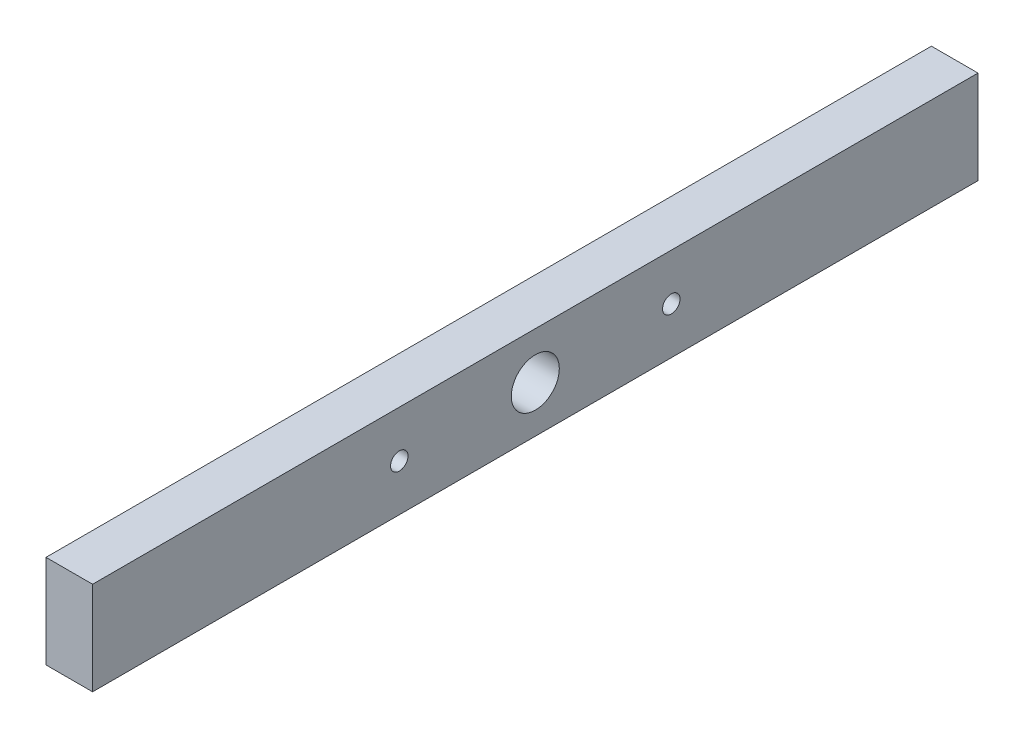
ISO-10303-21;
HEADER;
FILE_DESCRIPTION(('STEP AP214'),'2;1');
FILE_NAME('part.step','',(''),(''),'','','');
FILE_SCHEMA(('AUTOMOTIVE_DESIGN { 1 0 10303 214 1 1 1 1 }'));
ENDSEC;
DATA;
#1=APPLICATION_CONTEXT('core data for automotive mechanical design processes');
#2=APPLICATION_PROTOCOL_DEFINITION('international standard','automotive_design',2000,#1);
#3=PRODUCT_CONTEXT('',#1,'mechanical');
#4=PRODUCT('Part','Part','',(#3));
#5=PRODUCT_RELATED_PRODUCT_CATEGORY('part','',(#4));
#6=PRODUCT_DEFINITION_FORMATION('','',#4);
#7=PRODUCT_DEFINITION_CONTEXT('part definition',#1,'design');
#8=PRODUCT_DEFINITION('design','',#6,#7);
#9=PRODUCT_DEFINITION_SHAPE('','',#8);
#10=(LENGTH_UNIT() NAMED_UNIT(*) SI_UNIT(.MILLI.,.METRE.));
#11=(NAMED_UNIT(*) PLANE_ANGLE_UNIT() SI_UNIT($,.RADIAN.));
#12=(NAMED_UNIT(*) SI_UNIT($,.STERADIAN.) SOLID_ANGLE_UNIT());
#13=UNCERTAINTY_MEASURE_WITH_UNIT(LENGTH_MEASURE(1.E-05),#10,'distance_accuracy_value','');
#14=(GEOMETRIC_REPRESENTATION_CONTEXT(3) GLOBAL_UNCERTAINTY_ASSIGNED_CONTEXT((#13)) GLOBAL_UNIT_ASSIGNED_CONTEXT((#10,
#11,#12)) REPRESENTATION_CONTEXT('',''));
#15=CARTESIAN_POINT('',(0.,0.,0.));
#16=DIRECTION('',(0.,0.,1.));
#17=DIRECTION('',(1.,0.,0.));
#18=AXIS2_PLACEMENT_3D('',#15,#16,#17);
#19=CARTESIAN_POINT('',(20.,0.,0.));
#20=DIRECTION('',(0.,1.,0.));
#21=DIRECTION('',(0.,0.,1.));
#22=AXIS2_PLACEMENT_3D('',#19,#20,#21);
#23=PLANE('',#22);
#24=DIRECTION('',(0.,0.,-1.));
#25=VECTOR('',#24,1.);
#26=CARTESIAN_POINT('',(0.,0.,0.));
#27=LINE('',#26,#25);
#28=CARTESIAN_POINT('',(0.,0.,0.));
#29=VERTEX_POINT('',#28);
#30=CARTESIAN_POINT('',(0.,0.,-380.));
#31=VERTEX_POINT('',#30);
#32=EDGE_CURVE('E126',#29,#31,#27,.T.);
#33=ORIENTED_EDGE('',*,*,#32,.T.);
#34=DIRECTION('',(-1.,0.,0.));
#35=VECTOR('',#34,1.);
#36=CARTESIAN_POINT('',(20.,0.,-380.));
#37=LINE('',#36,#35);
#38=CARTESIAN_POINT('',(20.,0.,-380.));
#39=VERTEX_POINT('',#38);
#40=EDGE_CURVE('E11',#39,#31,#37,.T.);
#41=ORIENTED_EDGE('',*,*,#40,.F.);
#42=DIRECTION('',(0.,0.,-1.));
#43=VECTOR('',#42,1.);
#44=CARTESIAN_POINT('',(20.,0.,0.));
#45=LINE('',#44,#43);
#46=CARTESIAN_POINT('',(20.,0.,0.));
#47=VERTEX_POINT('',#46);
#48=EDGE_CURVE('E96',#47,#39,#45,.T.);
#49=ORIENTED_EDGE('',*,*,#48,.F.);
#50=DIRECTION('',(-1.,0.,0.));
#51=VECTOR('',#50,1.);
#52=CARTESIAN_POINT('',(20.,0.,0.));
#53=LINE('',#52,#51);
#54=EDGE_CURVE('E63',#47,#29,#53,.T.);
#55=ORIENTED_EDGE('',*,*,#54,.T.);
#56=EDGE_LOOP('',(#33,#41,#49,#55));
#57=FACE_BOUND('',#56,.T.);
#58=ADVANCED_FACE('F45',(#57),#23,.F.);
#59=CARTESIAN_POINT('',(20.,0.,-380.));
#60=DIRECTION('',(0.,0.,1.));
#61=DIRECTION('',(1.,0.,0.));
#62=AXIS2_PLACEMENT_3D('',#59,#60,#61);
#63=PLANE('',#62);
#64=DIRECTION('',(0.,1.,0.));
#65=VECTOR('',#64,1.);
#66=CARTESIAN_POINT('',(0.,0.,-380.));
#67=LINE('',#66,#65);
#68=CARTESIAN_POINT('',(0.,40.,-380.));
#69=VERTEX_POINT('',#68);
#70=EDGE_CURVE('E102',#31,#69,#67,.T.);
#71=ORIENTED_EDGE('',*,*,#70,.T.);
#72=DIRECTION('',(-1.,0.,0.));
#73=VECTOR('',#72,1.);
#74=CARTESIAN_POINT('',(20.,40.,-380.));
#75=LINE('',#74,#73);
#76=CARTESIAN_POINT('',(20.,40.,-380.));
#77=VERTEX_POINT('',#76);
#78=EDGE_CURVE('E55',#77,#69,#75,.T.);
#79=ORIENTED_EDGE('',*,*,#78,.F.);
#80=DIRECTION('',(0.,1.,0.));
#81=VECTOR('',#80,1.);
#82=CARTESIAN_POINT('',(20.,0.,-380.));
#83=LINE('',#82,#81);
#84=EDGE_CURVE('E88',#39,#77,#83,.T.);
#85=ORIENTED_EDGE('',*,*,#84,.F.);
#86=ORIENTED_EDGE('',*,*,#40,.T.);
#87=EDGE_LOOP('',(#71,#79,#85,#86));
#88=FACE_BOUND('',#87,.T.);
#89=ADVANCED_FACE('F101',(#88),#63,.F.);
#90=CARTESIAN_POINT('',(20.,40.,0.));
#91=DIRECTION('',(0.,1.,0.));
#92=DIRECTION('',(0.,0.,1.));
#93=AXIS2_PLACEMENT_3D('',#90,#91,#92);
#94=PLANE('',#93);
#95=DIRECTION('',(0.,0.,-1.));
#96=VECTOR('',#95,1.);
#97=CARTESIAN_POINT('',(0.,40.,0.));
#98=LINE('',#97,#96);
#99=CARTESIAN_POINT('',(0.,40.,0.));
#100=VERTEX_POINT('',#99);
#101=EDGE_CURVE('E131',#100,#69,#98,.T.);
#102=ORIENTED_EDGE('',*,*,#101,.F.);
#103=DIRECTION('',(-1.,0.,0.));
#104=VECTOR('',#103,1.);
#105=CARTESIAN_POINT('',(20.,40.,0.));
#106=LINE('',#105,#104);
#107=CARTESIAN_POINT('',(20.,40.,0.));
#108=VERTEX_POINT('',#107);
#109=EDGE_CURVE('E77',#108,#100,#106,.T.);
#110=ORIENTED_EDGE('',*,*,#109,.F.);
#111=DIRECTION('',(0.,0.,-1.));
#112=VECTOR('',#111,1.);
#113=CARTESIAN_POINT('',(20.,40.,0.));
#114=LINE('',#113,#112);
#115=EDGE_CURVE('E95',#108,#77,#114,.T.);
#116=ORIENTED_EDGE('',*,*,#115,.T.);
#117=ORIENTED_EDGE('',*,*,#78,.T.);
#118=EDGE_LOOP('',(#102,#110,#116,#117));
#119=FACE_BOUND('',#118,.T.);
#120=ADVANCED_FACE('F106',(#119),#94,.T.);
#121=CARTESIAN_POINT('',(20.,20.,-190.));
#122=DIRECTION('',(-1.,0.,0.));
#123=DIRECTION('',(0.,0.,1.));
#124=AXIS2_PLACEMENT_3D('',#121,#122,#123);
#125=CYLINDRICAL_SURFACE('',#124,10.3016882991591);
#126=CARTESIAN_POINT('',(20.,20.,-190.));
#127=DIRECTION('',(1.,0.,0.));
#128=DIRECTION('',(0.,0.,-1.));
#129=AXIS2_PLACEMENT_3D('',#126,#127,#128);
#130=CIRCLE('',#129,10.3016882991591);
#131=CARTESIAN_POINT('',(20.,20.,-200.301688299159));
#132=VERTEX_POINT('',#131);
#133=EDGE_CURVE('E151',#132,#132,#130,.T.);
#134=ORIENTED_EDGE('',*,*,#133,.T.);
#135=EDGE_LOOP('',(#134));
#136=FACE_BOUND('',#135,.T.);
#137=CARTESIAN_POINT('',(0.,20.,-190.));
#138=DIRECTION('',(1.,0.,0.));
#139=DIRECTION('',(0.,0.,-1.));
#140=AXIS2_PLACEMENT_3D('',#137,#138,#139);
#141=CIRCLE('',#140,10.3016882991591);
#142=CARTESIAN_POINT('',(0.,20.,-200.301688299159));
#143=VERTEX_POINT('',#142);
#144=EDGE_CURVE('E122',#143,#143,#141,.T.);
#145=ORIENTED_EDGE('',*,*,#144,.F.);
#146=EDGE_LOOP('',(#145));
#147=FACE_BOUND('',#146,.T.);
#148=ADVANCED_FACE('F159',(#136,#147),#125,.F.);
#149=CARTESIAN_POINT('',(20.,20.,-131.63));
#150=DIRECTION('',(-1.,0.,0.));
#151=DIRECTION('',(0.,0.,1.));
#152=AXIS2_PLACEMENT_3D('',#149,#150,#151);
#153=CYLINDRICAL_SURFACE('',#152,3.75000000000001);
#154=CARTESIAN_POINT('',(20.,20.,-131.63));
#155=DIRECTION('',(1.,0.,0.));
#156=DIRECTION('',(0.,0.,-1.));
#157=AXIS2_PLACEMENT_3D('',#154,#155,#156);
#158=CIRCLE('',#157,3.75000000000001);
#159=CARTESIAN_POINT('',(20.,20.,-135.38));
#160=VERTEX_POINT('',#159);
#161=EDGE_CURVE('E145',#160,#160,#158,.T.);
#162=ORIENTED_EDGE('',*,*,#161,.T.);
#163=EDGE_LOOP('',(#162));
#164=FACE_BOUND('',#163,.T.);
#165=CARTESIAN_POINT('',(0.,20.,-131.63));
#166=DIRECTION('',(1.,0.,0.));
#167=DIRECTION('',(0.,0.,-1.));
#168=AXIS2_PLACEMENT_3D('',#165,#166,#167);
#169=CIRCLE('',#168,3.75000000000001);
#170=CARTESIAN_POINT('',(0.,20.,-135.38));
#171=VERTEX_POINT('',#170);
#172=EDGE_CURVE('E118',#171,#171,#169,.T.);
#173=ORIENTED_EDGE('',*,*,#172,.F.);
#174=EDGE_LOOP('',(#173));
#175=FACE_BOUND('',#174,.T.);
#176=ADVANCED_FACE('F184',(#164,#175),#153,.F.);
#177=CARTESIAN_POINT('',(20.,20.,-248.37));
#178=DIRECTION('',(-1.,0.,0.));
#179=DIRECTION('',(0.,0.,1.));
#180=AXIS2_PLACEMENT_3D('',#177,#178,#179);
#181=CYLINDRICAL_SURFACE('',#180,3.75000000000001);
#182=CARTESIAN_POINT('',(20.,20.,-248.37));
#183=DIRECTION('',(1.,0.,0.));
#184=DIRECTION('',(0.,0.,-1.));
#185=AXIS2_PLACEMENT_3D('',#182,#183,#184);
#186=CIRCLE('',#185,3.75000000000001);
#187=CARTESIAN_POINT('',(20.,20.,-252.12));
#188=VERTEX_POINT('',#187);
#189=EDGE_CURVE('E138',#188,#188,#186,.T.);
#190=ORIENTED_EDGE('',*,*,#189,.T.);
#191=EDGE_LOOP('',(#190));
#192=FACE_BOUND('',#191,.T.);
#193=CARTESIAN_POINT('',(0.,20.,-248.37));
#194=DIRECTION('',(1.,0.,0.));
#195=DIRECTION('',(0.,0.,-1.));
#196=AXIS2_PLACEMENT_3D('',#193,#194,#195);
#197=CIRCLE('',#196,3.75000000000001);
#198=CARTESIAN_POINT('',(0.,20.,-252.12));
#199=VERTEX_POINT('',#198);
#200=EDGE_CURVE('E114',#199,#199,#197,.T.);
#201=ORIENTED_EDGE('',*,*,#200,.F.);
#202=EDGE_LOOP('',(#201));
#203=FACE_BOUND('',#202,.T.);
#204=ADVANCED_FACE('F47',(#192,#203),#181,.F.);
#205=CARTESIAN_POINT('',(20.,0.,0.));
#206=DIRECTION('',(0.,0.,1.));
#207=DIRECTION('',(1.,0.,0.));
#208=AXIS2_PLACEMENT_3D('',#205,#206,#207);
#209=PLANE('',#208);
#210=DIRECTION('',(0.,1.,0.));
#211=VECTOR('',#210,1.);
#212=CARTESIAN_POINT('',(0.,0.,0.));
#213=LINE('',#212,#211);
#214=EDGE_CURVE('E134',#29,#100,#213,.T.);
#215=ORIENTED_EDGE('',*,*,#214,.F.);
#216=ORIENTED_EDGE('',*,*,#54,.F.);
#217=DIRECTION('',(0.,1.,0.));
#218=VECTOR('',#217,1.);
#219=CARTESIAN_POINT('',(20.,0.,0.));
#220=LINE('',#219,#218);
#221=EDGE_CURVE('E108',#47,#108,#220,.T.);
#222=ORIENTED_EDGE('',*,*,#221,.T.);
#223=ORIENTED_EDGE('',*,*,#109,.T.);
#224=EDGE_LOOP('',(#215,#216,#222,#223));
#225=FACE_BOUND('',#224,.T.);
#226=ADVANCED_FACE('F164',(#225),#209,.T.);
#227=CARTESIAN_POINT('',(20.,0.,0.));
#228=DIRECTION('',(1.,0.,0.));
#229=DIRECTION('',(0.,0.,-1.));
#230=AXIS2_PLACEMENT_3D('',#227,#228,#229);
#231=PLANE('',#230);
#232=ORIENTED_EDGE('',*,*,#189,.F.);
#233=EDGE_LOOP('',(#232));
#234=FACE_BOUND('',#233,.T.);
#235=ORIENTED_EDGE('',*,*,#161,.F.);
#236=EDGE_LOOP('',(#235));
#237=FACE_BOUND('',#236,.T.);
#238=ORIENTED_EDGE('',*,*,#133,.F.);
#239=EDGE_LOOP('',(#238));
#240=FACE_BOUND('',#239,.T.);
#241=ORIENTED_EDGE('',*,*,#48,.T.);
#242=ORIENTED_EDGE('',*,*,#84,.T.);
#243=ORIENTED_EDGE('',*,*,#115,.F.);
#244=ORIENTED_EDGE('',*,*,#221,.F.);
#245=EDGE_LOOP('',(#241,#242,#243,#244));
#246=FACE_BOUND('',#245,.T.);
#247=ADVANCED_FACE('F92',(#234,#237,#240,#246),#231,.T.);
#248=CARTESIAN_POINT('',(0.,0.,0.));
#249=DIRECTION('',(1.,0.,0.));
#250=DIRECTION('',(0.,0.,-1.));
#251=AXIS2_PLACEMENT_3D('',#248,#249,#250);
#252=PLANE('',#251);
#253=ORIENTED_EDGE('',*,*,#200,.T.);
#254=EDGE_LOOP('',(#253));
#255=FACE_BOUND('',#254,.T.);
#256=ORIENTED_EDGE('',*,*,#172,.T.);
#257=EDGE_LOOP('',(#256));
#258=FACE_BOUND('',#257,.T.);
#259=ORIENTED_EDGE('',*,*,#144,.T.);
#260=EDGE_LOOP('',(#259));
#261=FACE_BOUND('',#260,.T.);
#262=ORIENTED_EDGE('',*,*,#32,.F.);
#263=ORIENTED_EDGE('',*,*,#214,.T.);
#264=ORIENTED_EDGE('',*,*,#101,.T.);
#265=ORIENTED_EDGE('',*,*,#70,.F.);
#266=EDGE_LOOP('',(#262,#263,#264,#265));
#267=FACE_BOUND('',#266,.T.);
#268=ADVANCED_FACE('F163',(#255,#258,#261,#267),#252,.F.);
#269=CLOSED_SHELL('',(#58,#89,#120,#148,#176,#204,#226,#247,#268));
#270=MANIFOLD_SOLID_BREP('B2',#269);
#271=ADVANCED_BREP_SHAPE_REPRESENTATION('',(#18,#270),#14);
#272=SHAPE_DEFINITION_REPRESENTATION(#9,#271);
ENDSEC;
END-ISO-10303-21;
